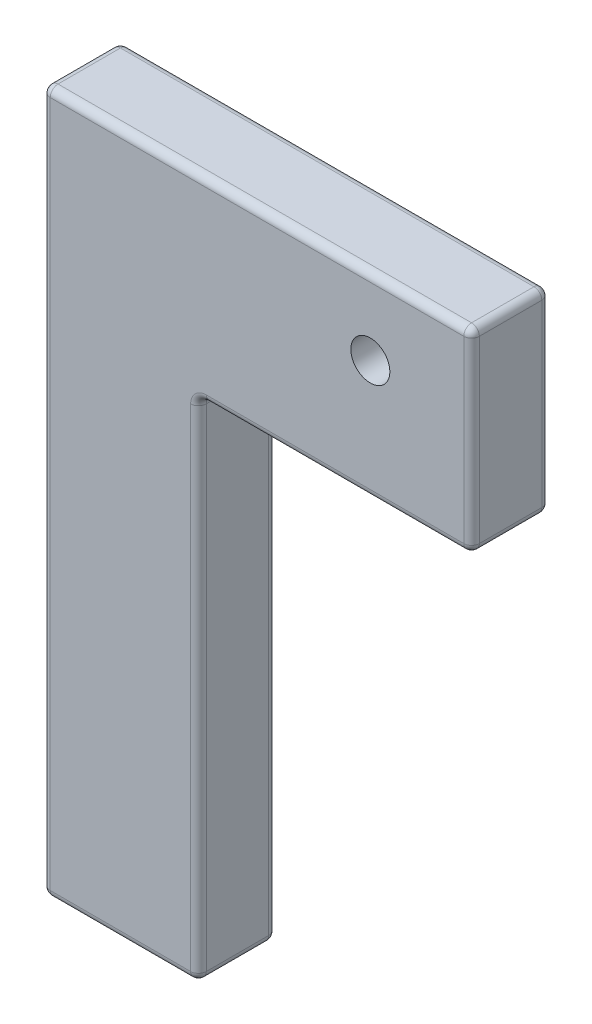
ISO-10303-21;
HEADER;
FILE_DESCRIPTION(('STEP AP214'),'2;1');
FILE_NAME('part.step','',(''),(''),'','','');
FILE_SCHEMA(('AUTOMOTIVE_DESIGN { 1 0 10303 214 1 1 1 1 }'));
ENDSEC;
DATA;
#1=APPLICATION_CONTEXT('core data for automotive mechanical design processes');
#2=APPLICATION_PROTOCOL_DEFINITION('international standard','automotive_design',2000,#1);
#3=PRODUCT_CONTEXT('',#1,'mechanical');
#4=PRODUCT('Part','Part','',(#3));
#5=PRODUCT_RELATED_PRODUCT_CATEGORY('part','',(#4));
#6=PRODUCT_DEFINITION_FORMATION('','',#4);
#7=PRODUCT_DEFINITION_CONTEXT('part definition',#1,'design');
#8=PRODUCT_DEFINITION('design','',#6,#7);
#9=PRODUCT_DEFINITION_SHAPE('','',#8);
#10=(LENGTH_UNIT() NAMED_UNIT(*) SI_UNIT(.MILLI.,.METRE.));
#11=(NAMED_UNIT(*) PLANE_ANGLE_UNIT() SI_UNIT($,.RADIAN.));
#12=(NAMED_UNIT(*) SI_UNIT($,.STERADIAN.) SOLID_ANGLE_UNIT());
#13=UNCERTAINTY_MEASURE_WITH_UNIT(LENGTH_MEASURE(1.E-05),#10,'distance_accuracy_value','');
#14=(GEOMETRIC_REPRESENTATION_CONTEXT(3) GLOBAL_UNCERTAINTY_ASSIGNED_CONTEXT((#13)) GLOBAL_UNIT_ASSIGNED_CONTEXT((#10,
#11,#12)) REPRESENTATION_CONTEXT('',''));
#15=CARTESIAN_POINT('',(0.,0.,0.));
#16=DIRECTION('',(0.,0.,1.));
#17=DIRECTION('',(1.,0.,0.));
#18=AXIS2_PLACEMENT_3D('',#15,#16,#17);
#19=CARTESIAN_POINT('',(0.,0.,10.));
#20=DIRECTION('',(0.,0.,-1.));
#21=DIRECTION('',(-1.,0.,0.));
#22=AXIS2_PLACEMENT_3D('',#19,#20,#21);
#23=PLANE('',#22);
#24=DIRECTION('',(0.,1.,0.));
#25=VECTOR('',#24,1.);
#26=CARTESIAN_POINT('',(54.,0.,10.));
#27=LINE('',#26,#25);
#28=CARTESIAN_POINT('',(54.,66.,10.));
#29=VERTEX_POINT('',#28);
#30=CARTESIAN_POINT('',(54.,89.,10.));
#31=VERTEX_POINT('',#30);
#32=EDGE_CURVE('E299',#29,#31,#27,.T.);
#33=ORIENTED_EDGE('',*,*,#32,.T.);
#34=DIRECTION('',(-1.,0.,0.));
#35=VECTOR('',#34,1.);
#36=CARTESIAN_POINT('',(0.,89.,10.));
#37=LINE('',#36,#35);
#38=CARTESIAN_POINT('',(1.,89.,10.));
#39=VERTEX_POINT('',#38);
#40=EDGE_CURVE('E302',#31,#39,#37,.T.);
#41=ORIENTED_EDGE('',*,*,#40,.T.);
#42=DIRECTION('',(0.,-1.,0.));
#43=VECTOR('',#42,1.);
#44=CARTESIAN_POINT('',(1.,0.,10.));
#45=LINE('',#44,#43);
#46=CARTESIAN_POINT('',(1.,1.,10.));
#47=VERTEX_POINT('',#46);
#48=EDGE_CURVE('E288',#39,#47,#45,.T.);
#49=ORIENTED_EDGE('',*,*,#48,.T.);
#50=DIRECTION('',(1.,0.,0.));
#51=VECTOR('',#50,1.);
#52=CARTESIAN_POINT('',(0.,1.,10.));
#53=LINE('',#52,#51);
#54=CARTESIAN_POINT('',(19.,1.,10.));
#55=VERTEX_POINT('',#54);
#56=EDGE_CURVE('E282',#47,#55,#53,.T.);
#57=ORIENTED_EDGE('',*,*,#56,.T.);
#58=DIRECTION('',(0.,1.,0.));
#59=VECTOR('',#58,1.);
#60=CARTESIAN_POINT('',(19.,0.,10.));
#61=LINE('',#60,#59);
#62=CARTESIAN_POINT('',(19.,64.,10.));
#63=VERTEX_POINT('',#62);
#64=EDGE_CURVE('E285',#55,#63,#61,.T.);
#65=ORIENTED_EDGE('',*,*,#64,.T.);
#66=CARTESIAN_POINT('',(21.,64.,10.));
#67=DIRECTION('',(0.,0.,-1.));
#68=DIRECTION('',(-1.,0.,0.));
#69=AXIS2_PLACEMENT_3D('',#66,#67,#68);
#70=CIRCLE('',#69,2.);
#71=CARTESIAN_POINT('',(21.,66.,10.));
#72=VERTEX_POINT('',#71);
#73=EDGE_CURVE('E292',#72,#63,#70,.F.);
#74=ORIENTED_EDGE('',*,*,#73,.F.);
#75=DIRECTION('',(1.,0.,0.));
#76=VECTOR('',#75,1.);
#77=CARTESIAN_POINT('',(0.,66.,10.));
#78=LINE('',#77,#76);
#79=EDGE_CURVE('E296',#72,#29,#78,.T.);
#80=ORIENTED_EDGE('',*,*,#79,.T.);
#81=EDGE_LOOP('',(#33,#41,#49,#57,#65,#74,#80));
#82=FACE_BOUND('',#81,.T.);
#83=CARTESIAN_POINT('',(42.0255877922333,80.3292942609596,10.));
#84=DIRECTION('',(0.,0.,1.));
#85=DIRECTION('',(1.,0.,0.));
#86=AXIS2_PLACEMENT_3D('',#83,#84,#85);
#87=CIRCLE('',#86,2.49999014943333);
#88=CARTESIAN_POINT('',(44.5255779416667,80.3292942609596,10.));
#89=VERTEX_POINT('',#88);
#90=EDGE_CURVE('E206',#89,#89,#87,.T.);
#91=ORIENTED_EDGE('',*,*,#90,.F.);
#92=EDGE_LOOP('',(#91));
#93=FACE_BOUND('',#92,.T.);
#94=ADVANCED_FACE('F39',(#82,#93),#23,.F.);
#95=CARTESIAN_POINT('',(0.,0.,0.));
#96=DIRECTION('',(0.,0.,-1.));
#97=DIRECTION('',(-1.,0.,0.));
#98=AXIS2_PLACEMENT_3D('',#95,#96,#97);
#99=PLANE('',#98);
#100=DIRECTION('',(1.,0.,0.));
#101=VECTOR('',#100,1.);
#102=CARTESIAN_POINT('',(0.,1.,0.));
#103=LINE('',#102,#101);
#104=CARTESIAN_POINT('',(19.,1.,0.));
#105=VERTEX_POINT('',#104);
#106=CARTESIAN_POINT('',(1.,1.,0.));
#107=VERTEX_POINT('',#106);
#108=EDGE_CURVE('E305',#105,#107,#103,.F.);
#109=ORIENTED_EDGE('',*,*,#108,.T.);
#110=DIRECTION('',(0.,-1.,0.));
#111=VECTOR('',#110,1.);
#112=CARTESIAN_POINT('',(1.,90.,0.));
#113=LINE('',#112,#111);
#114=CARTESIAN_POINT('',(1.,89.,0.));
#115=VERTEX_POINT('',#114);
#116=EDGE_CURVE('E11',#107,#115,#113,.F.);
#117=ORIENTED_EDGE('',*,*,#116,.T.);
#118=DIRECTION('',(-1.,0.,0.));
#119=VECTOR('',#118,1.);
#120=CARTESIAN_POINT('',(55.,89.,0.));
#121=LINE('',#120,#119);
#122=CARTESIAN_POINT('',(54.,89.,0.));
#123=VERTEX_POINT('',#122);
#124=EDGE_CURVE('E49',#115,#123,#121,.F.);
#125=ORIENTED_EDGE('',*,*,#124,.T.);
#126=DIRECTION('',(0.,1.,0.));
#127=VECTOR('',#126,1.);
#128=CARTESIAN_POINT('',(54.,65.,0.));
#129=LINE('',#128,#127);
#130=CARTESIAN_POINT('',(54.,66.,0.));
#131=VERTEX_POINT('',#130);
#132=EDGE_CURVE('E318',#123,#131,#129,.F.);
#133=ORIENTED_EDGE('',*,*,#132,.T.);
#134=DIRECTION('',(1.,0.,0.));
#135=VECTOR('',#134,1.);
#136=CARTESIAN_POINT('',(20.,66.,0.));
#137=LINE('',#136,#135);
#138=CARTESIAN_POINT('',(21.,66.,0.));
#139=VERTEX_POINT('',#138);
#140=EDGE_CURVE('E315',#131,#139,#137,.F.);
#141=ORIENTED_EDGE('',*,*,#140,.T.);
#142=CARTESIAN_POINT('',(21.,64.,0.));
#143=DIRECTION('',(0.,0.,-1.));
#144=DIRECTION('',(-1.,0.,0.));
#145=AXIS2_PLACEMENT_3D('',#142,#143,#144);
#146=CIRCLE('',#145,2.);
#147=CARTESIAN_POINT('',(19.,64.,0.));
#148=VERTEX_POINT('',#147);
#149=EDGE_CURVE('E311',#148,#139,#146,.T.);
#150=ORIENTED_EDGE('',*,*,#149,.F.);
#151=DIRECTION('',(0.,1.,0.));
#152=VECTOR('',#151,1.);
#153=CARTESIAN_POINT('',(19.,0.,0.));
#154=LINE('',#153,#152);
#155=EDGE_CURVE('E308',#148,#105,#154,.F.);
#156=ORIENTED_EDGE('',*,*,#155,.T.);
#157=EDGE_LOOP('',(#109,#117,#125,#133,#141,#150,#156));
#158=FACE_BOUND('',#157,.T.);
#159=CARTESIAN_POINT('',(42.0255877922333,80.3292942609596,0.));
#160=DIRECTION('',(0.,0.,1.));
#161=DIRECTION('',(1.,0.,0.));
#162=AXIS2_PLACEMENT_3D('',#159,#160,#161);
#163=CIRCLE('',#162,2.49999014943333);
#164=CARTESIAN_POINT('',(44.5255779416667,80.3292942609596,0.));
#165=VERTEX_POINT('',#164);
#166=EDGE_CURVE('E446',#165,#165,#163,.T.);
#167=ORIENTED_EDGE('',*,*,#166,.T.);
#168=EDGE_LOOP('',(#167));
#169=FACE_BOUND('',#168,.T.);
#170=ADVANCED_FACE('F465',(#158,#169),#99,.T.);
#171=CARTESIAN_POINT('',(20.,0.,10.));
#172=DIRECTION('',(0.,1.,0.));
#173=DIRECTION('',(0.,0.,1.));
#174=AXIS2_PLACEMENT_3D('',#171,#172,#173);
#175=PLANE('',#174);
#176=DIRECTION('',(0.,0.,-1.));
#177=VECTOR('',#176,1.);
#178=CARTESIAN_POINT('',(19.,0.,10.));
#179=LINE('',#178,#177);
#180=CARTESIAN_POINT('',(19.,0.,0.999999999999999));
#181=VERTEX_POINT('',#180);
#182=CARTESIAN_POINT('',(19.,0.,9.));
#183=VERTEX_POINT('',#182);
#184=EDGE_CURVE('E180',#181,#183,#179,.F.);
#185=ORIENTED_EDGE('',*,*,#184,.T.);
#186=DIRECTION('',(1.,0.,0.));
#187=VECTOR('',#186,1.);
#188=CARTESIAN_POINT('',(20.,0.,9.));
#189=LINE('',#188,#187);
#190=CARTESIAN_POINT('',(1.,0.,9.));
#191=VERTEX_POINT('',#190);
#192=EDGE_CURVE('E227',#183,#191,#189,.F.);
#193=ORIENTED_EDGE('',*,*,#192,.T.);
#194=DIRECTION('',(0.,0.,-1.));
#195=VECTOR('',#194,1.);
#196=CARTESIAN_POINT('',(1.,0.,10.));
#197=LINE('',#196,#195);
#198=CARTESIAN_POINT('',(1.,0.,0.999999999999999));
#199=VERTEX_POINT('',#198);
#200=EDGE_CURVE('E222',#191,#199,#197,.T.);
#201=ORIENTED_EDGE('',*,*,#200,.T.);
#202=DIRECTION('',(1.,0.,0.));
#203=VECTOR('',#202,1.);
#204=CARTESIAN_POINT('',(20.,0.,0.999999999999999));
#205=LINE('',#204,#203);
#206=EDGE_CURVE('E216',#199,#181,#205,.T.);
#207=ORIENTED_EDGE('',*,*,#206,.T.);
#208=EDGE_LOOP('',(#185,#193,#201,#207));
#209=FACE_BOUND('',#208,.T.);
#210=ADVANCED_FACE('F471',(#209),#175,.F.);
#211=CARTESIAN_POINT('',(20.,65.,10.));
#212=DIRECTION('',(-1.,0.,0.));
#213=DIRECTION('',(0.,-1.,0.));
#214=AXIS2_PLACEMENT_3D('',#211,#212,#213);
#215=PLANE('',#214);
#216=DIRECTION('',(0.,0.,-1.));
#217=VECTOR('',#216,1.);
#218=CARTESIAN_POINT('',(20.,64.,10.));
#219=LINE('',#218,#217);
#220=CARTESIAN_POINT('',(20.,64.,0.999999999999999));
#221=VERTEX_POINT('',#220);
#222=CARTESIAN_POINT('',(20.,64.,9.));
#223=VERTEX_POINT('',#222);
#224=EDGE_CURVE('E205',#221,#223,#219,.F.);
#225=ORIENTED_EDGE('',*,*,#224,.T.);
#226=DIRECTION('',(0.,1.,0.));
#227=VECTOR('',#226,1.);
#228=CARTESIAN_POINT('',(20.,65.,9.));
#229=LINE('',#228,#227);
#230=CARTESIAN_POINT('',(20.,1.,9.));
#231=VERTEX_POINT('',#230);
#232=EDGE_CURVE('E210',#223,#231,#229,.F.);
#233=ORIENTED_EDGE('',*,*,#232,.T.);
#234=DIRECTION('',(0.,0.,-1.));
#235=VECTOR('',#234,1.);
#236=CARTESIAN_POINT('',(20.,1.,10.));
#237=LINE('',#236,#235);
#238=CARTESIAN_POINT('',(20.,1.,0.999999999999999));
#239=VERTEX_POINT('',#238);
#240=EDGE_CURVE('E178',#231,#239,#237,.T.);
#241=ORIENTED_EDGE('',*,*,#240,.T.);
#242=DIRECTION('',(0.,1.,0.));
#243=VECTOR('',#242,1.);
#244=CARTESIAN_POINT('',(20.,65.,0.999999999999999));
#245=LINE('',#244,#243);
#246=EDGE_CURVE('E198',#239,#221,#245,.T.);
#247=ORIENTED_EDGE('',*,*,#246,.T.);
#248=EDGE_LOOP('',(#225,#233,#241,#247));
#249=FACE_BOUND('',#248,.T.);
#250=ADVANCED_FACE('F208',(#249),#215,.F.);
#251=CARTESIAN_POINT('',(55.,65.,10.));
#252=DIRECTION('',(0.,1.,0.));
#253=DIRECTION('',(0.,0.,1.));
#254=AXIS2_PLACEMENT_3D('',#251,#252,#253);
#255=PLANE('',#254);
#256=DIRECTION('',(0.,0.,-1.));
#257=VECTOR('',#256,1.);
#258=CARTESIAN_POINT('',(54.,65.,10.));
#259=LINE('',#258,#257);
#260=CARTESIAN_POINT('',(54.,65.,0.999999999999999));
#261=VERTEX_POINT('',#260);
#262=CARTESIAN_POINT('',(54.,65.,9.));
#263=VERTEX_POINT('',#262);
#264=EDGE_CURVE('E233',#261,#263,#259,.F.);
#265=ORIENTED_EDGE('',*,*,#264,.T.);
#266=DIRECTION('',(1.,0.,0.));
#267=VECTOR('',#266,1.);
#268=CARTESIAN_POINT('',(55.,65.,9.));
#269=LINE('',#268,#267);
#270=CARTESIAN_POINT('',(21.,65.,9.));
#271=VERTEX_POINT('',#270);
#272=EDGE_CURVE('E240',#263,#271,#269,.F.);
#273=ORIENTED_EDGE('',*,*,#272,.T.);
#274=DIRECTION('',(0.,0.,-1.));
#275=VECTOR('',#274,1.);
#276=CARTESIAN_POINT('',(21.,65.,0.));
#277=LINE('',#276,#275);
#278=CARTESIAN_POINT('',(21.,65.,0.999999999999999));
#279=VERTEX_POINT('',#278);
#280=EDGE_CURVE('E236',#271,#279,#277,.T.);
#281=ORIENTED_EDGE('',*,*,#280,.T.);
#282=DIRECTION('',(1.,0.,0.));
#283=VECTOR('',#282,1.);
#284=CARTESIAN_POINT('',(55.,65.,0.999999999999999));
#285=LINE('',#284,#283);
#286=EDGE_CURVE('E230',#279,#261,#285,.T.);
#287=ORIENTED_EDGE('',*,*,#286,.T.);
#288=EDGE_LOOP('',(#265,#273,#281,#287));
#289=FACE_BOUND('',#288,.T.);
#290=ADVANCED_FACE('F486',(#289),#255,.F.);
#291=CARTESIAN_POINT('',(55.,90.,10.));
#292=DIRECTION('',(-1.,0.,0.));
#293=DIRECTION('',(0.,0.,1.));
#294=AXIS2_PLACEMENT_3D('',#291,#292,#293);
#295=PLANE('',#294);
#296=DIRECTION('',(0.,0.,-1.));
#297=VECTOR('',#296,1.);
#298=CARTESIAN_POINT('',(55.,89.,10.));
#299=LINE('',#298,#297);
#300=CARTESIAN_POINT('',(55.,89.,0.999999999999999));
#301=VERTEX_POINT('',#300);
#302=CARTESIAN_POINT('',(55.,89.,9.));
#303=VERTEX_POINT('',#302);
#304=EDGE_CURVE('E246',#301,#303,#299,.F.);
#305=ORIENTED_EDGE('',*,*,#304,.T.);
#306=DIRECTION('',(0.,1.,0.));
#307=VECTOR('',#306,1.);
#308=CARTESIAN_POINT('',(55.,90.,9.));
#309=LINE('',#308,#307);
#310=CARTESIAN_POINT('',(55.,66.,9.));
#311=VERTEX_POINT('',#310);
#312=EDGE_CURVE('E253',#303,#311,#309,.F.);
#313=ORIENTED_EDGE('',*,*,#312,.T.);
#314=DIRECTION('',(0.,0.,-1.));
#315=VECTOR('',#314,1.);
#316=CARTESIAN_POINT('',(55.,66.,10.));
#317=LINE('',#316,#315);
#318=CARTESIAN_POINT('',(55.,66.,0.999999999999999));
#319=VERTEX_POINT('',#318);
#320=EDGE_CURVE('E249',#311,#319,#317,.T.);
#321=ORIENTED_EDGE('',*,*,#320,.T.);
#322=DIRECTION('',(0.,1.,0.));
#323=VECTOR('',#322,1.);
#324=CARTESIAN_POINT('',(55.,90.,0.999999999999999));
#325=LINE('',#324,#323);
#326=EDGE_CURVE('E243',#319,#301,#325,.T.);
#327=ORIENTED_EDGE('',*,*,#326,.T.);
#328=EDGE_LOOP('',(#305,#313,#321,#327));
#329=FACE_BOUND('',#328,.T.);
#330=ADVANCED_FACE('F482',(#329),#295,.F.);
#331=CARTESIAN_POINT('',(0.,90.,10.));
#332=DIRECTION('',(0.,-1.,0.));
#333=DIRECTION('',(0.,0.,-1.));
#334=AXIS2_PLACEMENT_3D('',#331,#332,#333);
#335=PLANE('',#334);
#336=DIRECTION('',(0.,0.,-1.));
#337=VECTOR('',#336,1.);
#338=CARTESIAN_POINT('',(1.,90.,10.));
#339=LINE('',#338,#337);
#340=CARTESIAN_POINT('',(1.,90.,0.999999999999999));
#341=VERTEX_POINT('',#340);
#342=CARTESIAN_POINT('',(1.,90.,9.));
#343=VERTEX_POINT('',#342);
#344=EDGE_CURVE('E259',#341,#343,#339,.F.);
#345=ORIENTED_EDGE('',*,*,#344,.T.);
#346=DIRECTION('',(-1.,0.,0.));
#347=VECTOR('',#346,1.);
#348=CARTESIAN_POINT('',(0.,90.,9.));
#349=LINE('',#348,#347);
#350=CARTESIAN_POINT('',(54.,90.,9.));
#351=VERTEX_POINT('',#350);
#352=EDGE_CURVE('E266',#343,#351,#349,.F.);
#353=ORIENTED_EDGE('',*,*,#352,.T.);
#354=DIRECTION('',(0.,0.,-1.));
#355=VECTOR('',#354,1.);
#356=CARTESIAN_POINT('',(54.,90.,10.));
#357=LINE('',#356,#355);
#358=CARTESIAN_POINT('',(54.,90.,0.999999999999999));
#359=VERTEX_POINT('',#358);
#360=EDGE_CURVE('E262',#351,#359,#357,.T.);
#361=ORIENTED_EDGE('',*,*,#360,.T.);
#362=DIRECTION('',(-1.,0.,0.));
#363=VECTOR('',#362,1.);
#364=CARTESIAN_POINT('',(0.,90.,0.999999999999999));
#365=LINE('',#364,#363);
#366=EDGE_CURVE('E256',#359,#341,#365,.T.);
#367=ORIENTED_EDGE('',*,*,#366,.T.);
#368=EDGE_LOOP('',(#345,#353,#361,#367));
#369=FACE_BOUND('',#368,.T.);
#370=ADVANCED_FACE('F478',(#369),#335,.F.);
#371=CARTESIAN_POINT('',(0.,0.,10.));
#372=DIRECTION('',(1.,0.,0.));
#373=DIRECTION('',(0.,0.,-1.));
#374=AXIS2_PLACEMENT_3D('',#371,#372,#373);
#375=PLANE('',#374);
#376=DIRECTION('',(0.,0.,-1.));
#377=VECTOR('',#376,1.);
#378=CARTESIAN_POINT('',(0.,1.,10.));
#379=LINE('',#378,#377);
#380=CARTESIAN_POINT('',(0.,1.,0.999999999999999));
#381=VERTEX_POINT('',#380);
#382=CARTESIAN_POINT('',(0.,1.,9.));
#383=VERTEX_POINT('',#382);
#384=EDGE_CURVE('E272',#381,#383,#379,.F.);
#385=ORIENTED_EDGE('',*,*,#384,.T.);
#386=DIRECTION('',(0.,-1.,0.));
#387=VECTOR('',#386,1.);
#388=CARTESIAN_POINT('',(0.,0.,9.));
#389=LINE('',#388,#387);
#390=CARTESIAN_POINT('',(0.,89.,9.));
#391=VERTEX_POINT('',#390);
#392=EDGE_CURVE('E279',#383,#391,#389,.F.);
#393=ORIENTED_EDGE('',*,*,#392,.T.);
#394=DIRECTION('',(0.,0.,-1.));
#395=VECTOR('',#394,1.);
#396=CARTESIAN_POINT('',(0.,89.,10.));
#397=LINE('',#396,#395);
#398=CARTESIAN_POINT('',(0.,89.,0.999999999999999));
#399=VERTEX_POINT('',#398);
#400=EDGE_CURVE('E275',#391,#399,#397,.T.);
#401=ORIENTED_EDGE('',*,*,#400,.T.);
#402=DIRECTION('',(0.,-1.,0.));
#403=VECTOR('',#402,1.);
#404=CARTESIAN_POINT('',(0.,0.,0.999999999999999));
#405=LINE('',#404,#403);
#406=EDGE_CURVE('E269',#399,#381,#405,.T.);
#407=ORIENTED_EDGE('',*,*,#406,.T.);
#408=EDGE_LOOP('',(#385,#393,#401,#407));
#409=FACE_BOUND('',#408,.T.);
#410=ADVANCED_FACE('F475',(#409),#375,.F.);
#411=CARTESIAN_POINT('',(42.0255877922333,80.3292942609596,10.));
#412=DIRECTION('',(0.,0.,-1.));
#413=DIRECTION('',(-1.,0.,0.));
#414=AXIS2_PLACEMENT_3D('',#411,#412,#413);
#415=CYLINDRICAL_SURFACE('',#414,2.49999014943333);
#416=ORIENTED_EDGE('',*,*,#90,.T.);
#417=EDGE_LOOP('',(#416));
#418=FACE_BOUND('',#417,.T.);
#419=ORIENTED_EDGE('',*,*,#166,.F.);
#420=EDGE_LOOP('',(#419));
#421=FACE_BOUND('',#420,.T.);
#422=ADVANCED_FACE('F461',(#418,#421),#415,.F.);
#423=CARTESIAN_POINT('',(54.,89.,10.));
#424=DIRECTION('',(0.,0.,-1.));
#425=DIRECTION('',(-1.,0.,0.));
#426=AXIS2_PLACEMENT_3D('',#423,#424,#425);
#427=CYLINDRICAL_SURFACE('',#426,1.);
#428=CARTESIAN_POINT('',(54.,89.,9.));
#429=DIRECTION('',(0.,0.,1.));
#430=DIRECTION('',(1.,0.,0.));
#431=AXIS2_PLACEMENT_3D('',#428,#429,#430);
#432=CIRCLE('',#431,1.);
#433=EDGE_CURVE('E43',#303,#351,#432,.T.);
#434=ORIENTED_EDGE('',*,*,#433,.F.);
#435=ORIENTED_EDGE('',*,*,#304,.F.);
#436=CARTESIAN_POINT('',(54.,89.,0.999999999999999));
#437=DIRECTION('',(0.,0.,-1.));
#438=DIRECTION('',(-1.,0.,0.));
#439=AXIS2_PLACEMENT_3D('',#436,#437,#438);
#440=CIRCLE('',#439,1.);
#441=EDGE_CURVE('E437',#359,#301,#440,.T.);
#442=ORIENTED_EDGE('',*,*,#441,.F.);
#443=ORIENTED_EDGE('',*,*,#360,.F.);
#444=EDGE_LOOP('',(#434,#435,#442,#443));
#445=FACE_BOUND('',#444,.T.);
#446=ADVANCED_FACE('F41',(#445),#427,.T.);
#447=CARTESIAN_POINT('',(54.,89.,9.));
#448=DIRECTION('',(0.,0.,1.));
#449=DIRECTION('',(1.,0.,0.));
#450=AXIS2_PLACEMENT_3D('',#447,#448,#449);
#451=SPHERICAL_SURFACE('',#450,1.);
#452=CARTESIAN_POINT('',(54.,89.,9.));
#453=DIRECTION('',(0.,1.,0.));
#454=DIRECTION('',(0.,0.,1.));
#455=AXIS2_PLACEMENT_3D('',#452,#453,#454);
#456=CIRCLE('',#455,1.);
#457=EDGE_CURVE('E430',#303,#31,#456,.F.);
#458=ORIENTED_EDGE('',*,*,#457,.F.);
#459=ORIENTED_EDGE('',*,*,#433,.T.);
#460=CARTESIAN_POINT('',(54.,89.,9.));
#461=DIRECTION('',(1.,0.,0.));
#462=DIRECTION('',(0.,0.,-1.));
#463=AXIS2_PLACEMENT_3D('',#460,#461,#462);
#464=CIRCLE('',#463,1.);
#465=EDGE_CURVE('E434',#31,#351,#464,.F.);
#466=ORIENTED_EDGE('',*,*,#465,.F.);
#467=EDGE_LOOP('',(#458,#459,#466));
#468=FACE_BOUND('',#467,.T.);
#469=ADVANCED_FACE('F599',(#468),#451,.T.);
#470=CARTESIAN_POINT('',(54.,89.,1.));
#471=DIRECTION('',(0.,0.,1.));
#472=DIRECTION('',(1.,0.,0.));
#473=AXIS2_PLACEMENT_3D('',#470,#471,#472);
#474=SPHERICAL_SURFACE('',#473,1.);
#475=CARTESIAN_POINT('',(54.,89.,1.));
#476=DIRECTION('',(1.,0.,0.));
#477=DIRECTION('',(0.,0.,-1.));
#478=AXIS2_PLACEMENT_3D('',#475,#476,#477);
#479=CIRCLE('',#478,1.);
#480=EDGE_CURVE('E423',#359,#123,#479,.F.);
#481=ORIENTED_EDGE('',*,*,#480,.F.);
#482=ORIENTED_EDGE('',*,*,#441,.T.);
#483=CARTESIAN_POINT('',(54.,89.,0.999999999999999));
#484=DIRECTION('',(0.,1.,0.));
#485=DIRECTION('',(0.,0.,1.));
#486=AXIS2_PLACEMENT_3D('',#483,#484,#485);
#487=CIRCLE('',#486,1.);
#488=EDGE_CURVE('E426',#123,#301,#487,.F.);
#489=ORIENTED_EDGE('',*,*,#488,.F.);
#490=EDGE_LOOP('',(#481,#482,#489));
#491=FACE_BOUND('',#490,.T.);
#492=ADVANCED_FACE('F596',(#491),#474,.T.);
#493=CARTESIAN_POINT('',(0.,89.,9.));
#494=DIRECTION('',(-1.,0.,0.));
#495=DIRECTION('',(0.,0.,1.));
#496=AXIS2_PLACEMENT_3D('',#493,#494,#495);
#497=CYLINDRICAL_SURFACE('',#496,1.);
#498=ORIENTED_EDGE('',*,*,#465,.T.);
#499=ORIENTED_EDGE('',*,*,#352,.F.);
#500=CARTESIAN_POINT('',(1.,89.,9.));
#501=DIRECTION('',(-1.,0.,0.));
#502=DIRECTION('',(0.,0.,1.));
#503=AXIS2_PLACEMENT_3D('',#500,#501,#502);
#504=CIRCLE('',#503,1.);
#505=EDGE_CURVE('E415',#39,#343,#504,.T.);
#506=ORIENTED_EDGE('',*,*,#505,.F.);
#507=ORIENTED_EDGE('',*,*,#40,.F.);
#508=EDGE_LOOP('',(#498,#499,#506,#507));
#509=FACE_BOUND('',#508,.T.);
#510=ADVANCED_FACE('F592',(#509),#497,.T.);
#511=CARTESIAN_POINT('',(54.,0.,9.));
#512=DIRECTION('',(0.,1.,0.));
#513=DIRECTION('',(0.,0.,1.));
#514=AXIS2_PLACEMENT_3D('',#511,#512,#513);
#515=CYLINDRICAL_SURFACE('',#514,1.);
#516=ORIENTED_EDGE('',*,*,#457,.T.);
#517=ORIENTED_EDGE('',*,*,#32,.F.);
#518=CARTESIAN_POINT('',(54.,66.,9.));
#519=DIRECTION('',(0.,-1.,0.));
#520=DIRECTION('',(0.,0.,-1.));
#521=AXIS2_PLACEMENT_3D('',#518,#519,#520);
#522=CIRCLE('',#521,1.);
#523=EDGE_CURVE('E411',#311,#29,#522,.T.);
#524=ORIENTED_EDGE('',*,*,#523,.F.);
#525=ORIENTED_EDGE('',*,*,#312,.F.);
#526=EDGE_LOOP('',(#516,#517,#524,#525));
#527=FACE_BOUND('',#526,.T.);
#528=ADVANCED_FACE('F588',(#527),#515,.T.);
#529=CARTESIAN_POINT('',(54.,66.,10.));
#530=DIRECTION('',(0.,0.,-1.));
#531=DIRECTION('',(-1.,0.,0.));
#532=AXIS2_PLACEMENT_3D('',#529,#530,#531);
#533=CYLINDRICAL_SURFACE('',#532,1.);
#534=CARTESIAN_POINT('',(54.,66.,0.999999999999999));
#535=DIRECTION('',(0.,0.,-1.));
#536=DIRECTION('',(-1.,0.,0.));
#537=AXIS2_PLACEMENT_3D('',#534,#535,#536);
#538=CIRCLE('',#537,1.);
#539=EDGE_CURVE('E403',#319,#261,#538,.T.);
#540=ORIENTED_EDGE('',*,*,#539,.F.);
#541=ORIENTED_EDGE('',*,*,#320,.F.);
#542=CARTESIAN_POINT('',(54.,66.,9.));
#543=DIRECTION('',(0.,0.,1.));
#544=DIRECTION('',(1.,0.,0.));
#545=AXIS2_PLACEMENT_3D('',#542,#543,#544);
#546=CIRCLE('',#545,1.);
#547=EDGE_CURVE('E407',#263,#311,#546,.T.);
#548=ORIENTED_EDGE('',*,*,#547,.F.);
#549=ORIENTED_EDGE('',*,*,#264,.F.);
#550=EDGE_LOOP('',(#540,#541,#548,#549));
#551=FACE_BOUND('',#550,.T.);
#552=ADVANCED_FACE('F584',(#551),#533,.T.);
#553=CARTESIAN_POINT('',(54.,90.,0.999999999999999));
#554=DIRECTION('',(0.,-1.,0.));
#555=DIRECTION('',(0.,0.,-1.));
#556=AXIS2_PLACEMENT_3D('',#553,#554,#555);
#557=CYLINDRICAL_SURFACE('',#556,1.);
#558=ORIENTED_EDGE('',*,*,#488,.T.);
#559=ORIENTED_EDGE('',*,*,#326,.F.);
#560=CARTESIAN_POINT('',(54.,66.,1.));
#561=DIRECTION('',(0.,-1.,0.));
#562=DIRECTION('',(0.,0.,-1.));
#563=AXIS2_PLACEMENT_3D('',#560,#561,#562);
#564=CIRCLE('',#563,1.);
#565=EDGE_CURVE('E400',#131,#319,#564,.T.);
#566=ORIENTED_EDGE('',*,*,#565,.F.);
#567=ORIENTED_EDGE('',*,*,#132,.F.);
#568=EDGE_LOOP('',(#558,#559,#566,#567));
#569=FACE_BOUND('',#568,.T.);
#570=ADVANCED_FACE('F580',(#569),#557,.T.);
#571=CARTESIAN_POINT('',(0.,89.,0.999999999999999));
#572=DIRECTION('',(1.,0.,0.));
#573=DIRECTION('',(0.,0.,-1.));
#574=AXIS2_PLACEMENT_3D('',#571,#572,#573);
#575=CYLINDRICAL_SURFACE('',#574,1.);
#576=ORIENTED_EDGE('',*,*,#480,.T.);
#577=ORIENTED_EDGE('',*,*,#124,.F.);
#578=CARTESIAN_POINT('',(1.,89.,0.999999999999999));
#579=DIRECTION('',(-1.,0.,0.));
#580=DIRECTION('',(0.,0.,1.));
#581=AXIS2_PLACEMENT_3D('',#578,#579,#580);
#582=CIRCLE('',#581,1.);
#583=EDGE_CURVE('E397',#341,#115,#582,.T.);
#584=ORIENTED_EDGE('',*,*,#583,.F.);
#585=ORIENTED_EDGE('',*,*,#366,.F.);
#586=EDGE_LOOP('',(#576,#577,#584,#585));
#587=FACE_BOUND('',#586,.T.);
#588=ADVANCED_FACE('F576',(#587),#575,.T.);
#589=CARTESIAN_POINT('',(1.,89.,10.));
#590=DIRECTION('',(0.,0.,-1.));
#591=DIRECTION('',(-1.,0.,0.));
#592=AXIS2_PLACEMENT_3D('',#589,#590,#591);
#593=CYLINDRICAL_SURFACE('',#592,1.);
#594=CARTESIAN_POINT('',(1.,89.,9.));
#595=DIRECTION('',(0.,0.,1.));
#596=DIRECTION('',(1.,0.,0.));
#597=AXIS2_PLACEMENT_3D('',#594,#595,#596);
#598=CIRCLE('',#597,1.);
#599=EDGE_CURVE('E419',#343,#391,#598,.T.);
#600=ORIENTED_EDGE('',*,*,#599,.F.);
#601=ORIENTED_EDGE('',*,*,#344,.F.);
#602=CARTESIAN_POINT('',(1.,89.,0.999999999999999));
#603=DIRECTION('',(0.,0.,-1.));
#604=DIRECTION('',(-1.,0.,0.));
#605=AXIS2_PLACEMENT_3D('',#602,#603,#604);
#606=CIRCLE('',#605,1.);
#607=EDGE_CURVE('E393',#399,#341,#606,.T.);
#608=ORIENTED_EDGE('',*,*,#607,.F.);
#609=ORIENTED_EDGE('',*,*,#400,.F.);
#610=EDGE_LOOP('',(#600,#601,#608,#609));
#611=FACE_BOUND('',#610,.T.);
#612=ADVANCED_FACE('F572',(#611),#593,.T.);
#613=CARTESIAN_POINT('',(1.,89.,9.));
#614=DIRECTION('',(0.,0.,1.));
#615=DIRECTION('',(1.,0.,0.));
#616=AXIS2_PLACEMENT_3D('',#613,#614,#615);
#617=SPHERICAL_SURFACE('',#616,1.);
#618=ORIENTED_EDGE('',*,*,#505,.T.);
#619=ORIENTED_EDGE('',*,*,#599,.T.);
#620=CARTESIAN_POINT('',(1.,89.,9.));
#621=DIRECTION('',(0.,1.,0.));
#622=DIRECTION('',(0.,0.,1.));
#623=AXIS2_PLACEMENT_3D('',#620,#621,#622);
#624=CIRCLE('',#623,1.);
#625=EDGE_CURVE('E389',#39,#391,#624,.F.);
#626=ORIENTED_EDGE('',*,*,#625,.F.);
#627=EDGE_LOOP('',(#618,#619,#626));
#628=FACE_BOUND('',#627,.T.);
#629=ADVANCED_FACE('F568',(#628),#617,.T.);
#630=CARTESIAN_POINT('',(54.,66.,9.));
#631=DIRECTION('',(0.,0.,1.));
#632=DIRECTION('',(1.,0.,0.));
#633=AXIS2_PLACEMENT_3D('',#630,#631,#632);
#634=SPHERICAL_SURFACE('',#633,1.);
#635=ORIENTED_EDGE('',*,*,#547,.T.);
#636=ORIENTED_EDGE('',*,*,#523,.T.);
#637=CARTESIAN_POINT('',(54.,66.,9.));
#638=DIRECTION('',(1.,0.,0.));
#639=DIRECTION('',(0.,0.,-1.));
#640=AXIS2_PLACEMENT_3D('',#637,#638,#639);
#641=CIRCLE('',#640,1.);
#642=EDGE_CURVE('E385',#263,#29,#641,.F.);
#643=ORIENTED_EDGE('',*,*,#642,.F.);
#644=EDGE_LOOP('',(#635,#636,#643));
#645=FACE_BOUND('',#644,.T.);
#646=ADVANCED_FACE('F564',(#645),#634,.T.);
#647=CARTESIAN_POINT('',(54.,66.,1.));
#648=DIRECTION('',(0.,0.,1.));
#649=DIRECTION('',(1.,0.,0.));
#650=AXIS2_PLACEMENT_3D('',#647,#648,#649);
#651=SPHERICAL_SURFACE('',#650,1.);
#652=ORIENTED_EDGE('',*,*,#565,.T.);
#653=ORIENTED_EDGE('',*,*,#539,.T.);
#654=CARTESIAN_POINT('',(54.,66.,0.999999999999999));
#655=DIRECTION('',(1.,0.,0.));
#656=DIRECTION('',(0.,0.,-1.));
#657=AXIS2_PLACEMENT_3D('',#654,#655,#656);
#658=CIRCLE('',#657,1.);
#659=EDGE_CURVE('E381',#131,#261,#658,.F.);
#660=ORIENTED_EDGE('',*,*,#659,.F.);
#661=EDGE_LOOP('',(#652,#653,#660));
#662=FACE_BOUND('',#661,.T.);
#663=ADVANCED_FACE('F560',(#662),#651,.T.);
#664=CARTESIAN_POINT('',(1.,89.,1.));
#665=DIRECTION('',(0.,0.,1.));
#666=DIRECTION('',(1.,0.,0.));
#667=AXIS2_PLACEMENT_3D('',#664,#665,#666);
#668=SPHERICAL_SURFACE('',#667,1.);
#669=ORIENTED_EDGE('',*,*,#607,.T.);
#670=ORIENTED_EDGE('',*,*,#583,.T.);
#671=CARTESIAN_POINT('',(1.,89.,1.));
#672=DIRECTION('',(0.,1.,0.));
#673=DIRECTION('',(0.,0.,1.));
#674=AXIS2_PLACEMENT_3D('',#671,#672,#673);
#675=CIRCLE('',#674,1.);
#676=EDGE_CURVE('E57',#399,#115,#675,.F.);
#677=ORIENTED_EDGE('',*,*,#676,.F.);
#678=EDGE_LOOP('',(#669,#670,#677));
#679=FACE_BOUND('',#678,.T.);
#680=ADVANCED_FACE('F556',(#679),#668,.T.);
#681=CARTESIAN_POINT('',(1.,0.,9.));
#682=DIRECTION('',(0.,-1.,0.));
#683=DIRECTION('',(0.,0.,-1.));
#684=AXIS2_PLACEMENT_3D('',#681,#682,#683);
#685=CYLINDRICAL_SURFACE('',#684,1.);
#686=ORIENTED_EDGE('',*,*,#625,.T.);
#687=ORIENTED_EDGE('',*,*,#392,.F.);
#688=CARTESIAN_POINT('',(1.,1.,9.));
#689=DIRECTION('',(0.,-1.,0.));
#690=DIRECTION('',(0.,0.,-1.));
#691=AXIS2_PLACEMENT_3D('',#688,#689,#690);
#692=CIRCLE('',#691,1.);
#693=EDGE_CURVE('E371',#47,#383,#692,.T.);
#694=ORIENTED_EDGE('',*,*,#693,.F.);
#695=ORIENTED_EDGE('',*,*,#48,.F.);
#696=EDGE_LOOP('',(#686,#687,#694,#695));
#697=FACE_BOUND('',#696,.T.);
#698=ADVANCED_FACE('F552',(#697),#685,.T.);
#699=CARTESIAN_POINT('',(0.,66.,9.));
#700=DIRECTION('',(1.,0.,0.));
#701=DIRECTION('',(0.,0.,-1.));
#702=AXIS2_PLACEMENT_3D('',#699,#700,#701);
#703=CYLINDRICAL_SURFACE('',#702,1.);
#704=ORIENTED_EDGE('',*,*,#642,.T.);
#705=ORIENTED_EDGE('',*,*,#79,.F.);
#706=CARTESIAN_POINT('',(21.,66.,9.));
#707=DIRECTION('',(-1.,0.,0.));
#708=DIRECTION('',(0.,0.,1.));
#709=AXIS2_PLACEMENT_3D('',#706,#707,#708);
#710=CIRCLE('',#709,1.);
#711=EDGE_CURVE('E367',#271,#72,#710,.T.);
#712=ORIENTED_EDGE('',*,*,#711,.F.);
#713=ORIENTED_EDGE('',*,*,#272,.F.);
#714=EDGE_LOOP('',(#704,#705,#712,#713));
#715=FACE_BOUND('',#714,.T.);
#716=ADVANCED_FACE('F548',(#715),#703,.T.);
#717=CARTESIAN_POINT('',(21.,64.,10.));
#718=DIRECTION('',(0.,0.,1.));
#719=DIRECTION('',(1.,0.,0.));
#720=AXIS2_PLACEMENT_3D('',#717,#718,#719);
#721=CYLINDRICAL_SURFACE('',#720,1.);
#722=CARTESIAN_POINT('',(21.,64.,0.999999999999999));
#723=DIRECTION('',(0.,0.,-1.));
#724=DIRECTION('',(-1.,0.,0.));
#725=AXIS2_PLACEMENT_3D('',#722,#723,#724);
#726=CIRCLE('',#725,1.);
#727=EDGE_CURVE('E359',#279,#221,#726,.F.);
#728=ORIENTED_EDGE('',*,*,#727,.F.);
#729=ORIENTED_EDGE('',*,*,#280,.F.);
#730=CARTESIAN_POINT('',(21.,64.,9.));
#731=DIRECTION('',(0.,0.,-1.));
#732=DIRECTION('',(-1.,0.,0.));
#733=AXIS2_PLACEMENT_3D('',#730,#731,#732);
#734=CIRCLE('',#733,1.);
#735=EDGE_CURVE('E363',#223,#271,#734,.T.);
#736=ORIENTED_EDGE('',*,*,#735,.F.);
#737=ORIENTED_EDGE('',*,*,#224,.F.);
#738=EDGE_LOOP('',(#728,#729,#736,#737));
#739=FACE_BOUND('',#738,.T.);
#740=ADVANCED_FACE('F544',(#739),#721,.F.);
#741=CARTESIAN_POINT('',(55.,66.,0.999999999999999));
#742=DIRECTION('',(-1.,0.,0.));
#743=DIRECTION('',(0.,0.,1.));
#744=AXIS2_PLACEMENT_3D('',#741,#742,#743);
#745=CYLINDRICAL_SURFACE('',#744,1.);
#746=ORIENTED_EDGE('',*,*,#659,.T.);
#747=ORIENTED_EDGE('',*,*,#286,.F.);
#748=CARTESIAN_POINT('',(21.,66.,1.));
#749=DIRECTION('',(-1.,0.,0.));
#750=DIRECTION('',(0.,0.,1.));
#751=AXIS2_PLACEMENT_3D('',#748,#749,#750);
#752=CIRCLE('',#751,1.);
#753=EDGE_CURVE('E356',#139,#279,#752,.T.);
#754=ORIENTED_EDGE('',*,*,#753,.F.);
#755=ORIENTED_EDGE('',*,*,#140,.F.);
#756=EDGE_LOOP('',(#746,#747,#754,#755));
#757=FACE_BOUND('',#756,.T.);
#758=ADVANCED_FACE('F541',(#757),#745,.T.);
#759=CARTESIAN_POINT('',(1.,0.,0.999999999999999));
#760=DIRECTION('',(0.,1.,0.));
#761=DIRECTION('',(0.,0.,1.));
#762=AXIS2_PLACEMENT_3D('',#759,#760,#761);
#763=CYLINDRICAL_SURFACE('',#762,1.);
#764=ORIENTED_EDGE('',*,*,#676,.T.);
#765=ORIENTED_EDGE('',*,*,#116,.F.);
#766=CARTESIAN_POINT('',(1.,1.,0.999999999999999));
#767=DIRECTION('',(0.,-1.,0.));
#768=DIRECTION('',(0.,0.,-1.));
#769=AXIS2_PLACEMENT_3D('',#766,#767,#768);
#770=CIRCLE('',#769,1.);
#771=EDGE_CURVE('E352',#381,#107,#770,.T.);
#772=ORIENTED_EDGE('',*,*,#771,.F.);
#773=ORIENTED_EDGE('',*,*,#406,.F.);
#774=EDGE_LOOP('',(#764,#765,#772,#773));
#775=FACE_BOUND('',#774,.T.);
#776=ADVANCED_FACE('F537',(#775),#763,.T.);
#777=CARTESIAN_POINT('',(1.,1.,10.));
#778=DIRECTION('',(0.,0.,-1.));
#779=DIRECTION('',(-1.,0.,0.));
#780=AXIS2_PLACEMENT_3D('',#777,#778,#779);
#781=CYLINDRICAL_SURFACE('',#780,1.);
#782=CARTESIAN_POINT('',(1.,1.,9.));
#783=DIRECTION('',(0.,0.,1.));
#784=DIRECTION('',(1.,0.,0.));
#785=AXIS2_PLACEMENT_3D('',#782,#783,#784);
#786=CIRCLE('',#785,1.);
#787=EDGE_CURVE('E375',#383,#191,#786,.T.);
#788=ORIENTED_EDGE('',*,*,#787,.F.);
#789=ORIENTED_EDGE('',*,*,#384,.F.);
#790=CARTESIAN_POINT('',(1.,1.,0.999999999999999));
#791=DIRECTION('',(0.,0.,-1.));
#792=DIRECTION('',(-1.,0.,0.));
#793=AXIS2_PLACEMENT_3D('',#790,#791,#792);
#794=CIRCLE('',#793,1.);
#795=EDGE_CURVE('E348',#199,#381,#794,.T.);
#796=ORIENTED_EDGE('',*,*,#795,.F.);
#797=ORIENTED_EDGE('',*,*,#200,.F.);
#798=EDGE_LOOP('',(#788,#789,#796,#797));
#799=FACE_BOUND('',#798,.T.);
#800=ADVANCED_FACE('F533',(#799),#781,.T.);
#801=CARTESIAN_POINT('',(1.,1.,9.));
#802=DIRECTION('',(0.,0.,1.));
#803=DIRECTION('',(1.,0.,0.));
#804=AXIS2_PLACEMENT_3D('',#801,#802,#803);
#805=SPHERICAL_SURFACE('',#804,1.);
#806=ORIENTED_EDGE('',*,*,#693,.T.);
#807=ORIENTED_EDGE('',*,*,#787,.T.);
#808=CARTESIAN_POINT('',(1.,1.,9.));
#809=DIRECTION('',(-1.,0.,0.));
#810=DIRECTION('',(0.,0.,1.));
#811=AXIS2_PLACEMENT_3D('',#808,#809,#810);
#812=CIRCLE('',#811,1.);
#813=EDGE_CURVE('E344',#47,#191,#812,.F.);
#814=ORIENTED_EDGE('',*,*,#813,.F.);
#815=EDGE_LOOP('',(#806,#807,#814));
#816=FACE_BOUND('',#815,.T.);
#817=ADVANCED_FACE('F529',(#816),#805,.T.);
#818=CARTESIAN_POINT('',(21.,64.,9.));
#819=DIRECTION('',(0.,0.,-1.));
#820=DIRECTION('',(-1.,0.,0.));
#821=AXIS2_PLACEMENT_3D('',#818,#819,#820);
#822=TOROIDAL_SURFACE('',#821,2.,1.);
#823=ORIENTED_EDGE('',*,*,#711,.T.);
#824=ORIENTED_EDGE('',*,*,#73,.T.);
#825=CARTESIAN_POINT('',(19.,64.,9.));
#826=DIRECTION('',(0.,1.,0.));
#827=DIRECTION('',(0.,0.,1.));
#828=AXIS2_PLACEMENT_3D('',#825,#826,#827);
#829=CIRCLE('',#828,1.);
#830=EDGE_CURVE('E340',#223,#63,#829,.F.);
#831=ORIENTED_EDGE('',*,*,#830,.F.);
#832=ORIENTED_EDGE('',*,*,#735,.T.);
#833=EDGE_LOOP('',(#823,#824,#831,#832));
#834=FACE_BOUND('',#833,.T.);
#835=ADVANCED_FACE('F525',(#834),#822,.T.);
#836=CARTESIAN_POINT('',(21.,64.,0.999999999999999));
#837=DIRECTION('',(0.,0.,-1.));
#838=DIRECTION('',(-1.,0.,0.));
#839=AXIS2_PLACEMENT_3D('',#836,#837,#838);
#840=TOROIDAL_SURFACE('',#839,2.,1.);
#841=ORIENTED_EDGE('',*,*,#753,.T.);
#842=ORIENTED_EDGE('',*,*,#727,.T.);
#843=CARTESIAN_POINT('',(19.,64.,0.999999999999999));
#844=DIRECTION('',(0.,1.,0.));
#845=DIRECTION('',(0.,0.,1.));
#846=AXIS2_PLACEMENT_3D('',#843,#844,#845);
#847=CIRCLE('',#846,1.);
#848=EDGE_CURVE('E201',#148,#221,#847,.F.);
#849=ORIENTED_EDGE('',*,*,#848,.F.);
#850=ORIENTED_EDGE('',*,*,#149,.T.);
#851=EDGE_LOOP('',(#841,#842,#849,#850));
#852=FACE_BOUND('',#851,.T.);
#853=ADVANCED_FACE('F521',(#852),#840,.T.);
#854=CARTESIAN_POINT('',(1.,1.,1.));
#855=DIRECTION('',(0.,0.,1.));
#856=DIRECTION('',(1.,0.,0.));
#857=AXIS2_PLACEMENT_3D('',#854,#855,#856);
#858=SPHERICAL_SURFACE('',#857,1.);
#859=ORIENTED_EDGE('',*,*,#795,.T.);
#860=ORIENTED_EDGE('',*,*,#771,.T.);
#861=CARTESIAN_POINT('',(1.,1.,1.));
#862=DIRECTION('',(-1.,0.,0.));
#863=DIRECTION('',(0.,-1.,0.));
#864=AXIS2_PLACEMENT_3D('',#861,#862,#863);
#865=CIRCLE('',#864,1.);
#866=EDGE_CURVE('E334',#199,#107,#865,.F.);
#867=ORIENTED_EDGE('',*,*,#866,.F.);
#868=EDGE_LOOP('',(#859,#860,#867));
#869=FACE_BOUND('',#868,.T.);
#870=ADVANCED_FACE('F517',(#869),#858,.T.);
#871=CARTESIAN_POINT('',(0.,1.,9.));
#872=DIRECTION('',(1.,0.,0.));
#873=DIRECTION('',(0.,0.,-1.));
#874=AXIS2_PLACEMENT_3D('',#871,#872,#873);
#875=CYLINDRICAL_SURFACE('',#874,1.);
#876=ORIENTED_EDGE('',*,*,#813,.T.);
#877=ORIENTED_EDGE('',*,*,#192,.F.);
#878=CARTESIAN_POINT('',(19.,1.,9.));
#879=DIRECTION('',(1.,0.,0.));
#880=DIRECTION('',(0.,0.,-1.));
#881=AXIS2_PLACEMENT_3D('',#878,#879,#880);
#882=CIRCLE('',#881,1.);
#883=EDGE_CURVE('E330',#55,#183,#882,.T.);
#884=ORIENTED_EDGE('',*,*,#883,.F.);
#885=ORIENTED_EDGE('',*,*,#56,.F.);
#886=EDGE_LOOP('',(#876,#877,#884,#885));
#887=FACE_BOUND('',#886,.T.);
#888=ADVANCED_FACE('F513',(#887),#875,.T.);
#889=CARTESIAN_POINT('',(19.,0.,9.));
#890=DIRECTION('',(0.,1.,0.));
#891=DIRECTION('',(-1.,0.,0.));
#892=AXIS2_PLACEMENT_3D('',#889,#890,#891);
#893=CYLINDRICAL_SURFACE('',#892,1.);
#894=ORIENTED_EDGE('',*,*,#830,.T.);
#895=ORIENTED_EDGE('',*,*,#64,.F.);
#896=CARTESIAN_POINT('',(19.,1.,9.));
#897=DIRECTION('',(0.,-1.,0.));
#898=DIRECTION('',(0.,0.,-1.));
#899=AXIS2_PLACEMENT_3D('',#896,#897,#898);
#900=CIRCLE('',#899,1.);
#901=EDGE_CURVE('E195',#231,#55,#900,.T.);
#902=ORIENTED_EDGE('',*,*,#901,.F.);
#903=ORIENTED_EDGE('',*,*,#232,.F.);
#904=EDGE_LOOP('',(#894,#895,#902,#903));
#905=FACE_BOUND('',#904,.T.);
#906=ADVANCED_FACE('F510',(#905),#893,.T.);
#907=CARTESIAN_POINT('',(19.,65.,0.999999999999999));
#908=DIRECTION('',(0.,-1.,0.));
#909=DIRECTION('',(1.,0.,0.));
#910=AXIS2_PLACEMENT_3D('',#907,#908,#909);
#911=CYLINDRICAL_SURFACE('',#910,1.);
#912=ORIENTED_EDGE('',*,*,#848,.T.);
#913=ORIENTED_EDGE('',*,*,#246,.F.);
#914=CARTESIAN_POINT('',(19.,1.,1.));
#915=DIRECTION('',(0.,-1.,0.));
#916=DIRECTION('',(1.,0.,0.));
#917=AXIS2_PLACEMENT_3D('',#914,#915,#916);
#918=CIRCLE('',#917,1.);
#919=EDGE_CURVE('E187',#105,#239,#918,.T.);
#920=ORIENTED_EDGE('',*,*,#919,.F.);
#921=ORIENTED_EDGE('',*,*,#155,.F.);
#922=EDGE_LOOP('',(#912,#913,#920,#921));
#923=FACE_BOUND('',#922,.T.);
#924=ADVANCED_FACE('F199',(#923),#911,.T.);
#925=CARTESIAN_POINT('',(20.,1.,0.999999999999999));
#926=DIRECTION('',(-1.,0.,0.));
#927=DIRECTION('',(0.,0.,1.));
#928=AXIS2_PLACEMENT_3D('',#925,#926,#927);
#929=CYLINDRICAL_SURFACE('',#928,1.);
#930=ORIENTED_EDGE('',*,*,#866,.T.);
#931=ORIENTED_EDGE('',*,*,#108,.F.);
#932=CARTESIAN_POINT('',(19.,1.,0.999999999999999));
#933=DIRECTION('',(1.,0.,0.));
#934=DIRECTION('',(0.,0.,-1.));
#935=AXIS2_PLACEMENT_3D('',#932,#933,#934);
#936=CIRCLE('',#935,1.);
#937=EDGE_CURVE('E191',#181,#105,#936,.T.);
#938=ORIENTED_EDGE('',*,*,#937,.F.);
#939=ORIENTED_EDGE('',*,*,#206,.F.);
#940=EDGE_LOOP('',(#930,#931,#938,#939));
#941=FACE_BOUND('',#940,.T.);
#942=ADVANCED_FACE('F503',(#941),#929,.T.);
#943=CARTESIAN_POINT('',(19.,1.,9.));
#944=DIRECTION('',(0.,0.,1.));
#945=DIRECTION('',(1.,0.,0.));
#946=AXIS2_PLACEMENT_3D('',#943,#944,#945);
#947=SPHERICAL_SURFACE('',#946,1.);
#948=ORIENTED_EDGE('',*,*,#901,.T.);
#949=ORIENTED_EDGE('',*,*,#883,.T.);
#950=CARTESIAN_POINT('',(19.,1.,9.));
#951=DIRECTION('',(0.,0.,1.));
#952=DIRECTION('',(1.,0.,0.));
#953=AXIS2_PLACEMENT_3D('',#950,#951,#952);
#954=CIRCLE('',#953,1.);
#955=EDGE_CURVE('E184',#231,#183,#954,.F.);
#956=ORIENTED_EDGE('',*,*,#955,.F.);
#957=EDGE_LOOP('',(#948,#949,#956));
#958=FACE_BOUND('',#957,.T.);
#959=ADVANCED_FACE('F500',(#958),#947,.T.);
#960=CARTESIAN_POINT('',(19.,1.,1.));
#961=DIRECTION('',(0.,0.,1.));
#962=DIRECTION('',(1.,0.,0.));
#963=AXIS2_PLACEMENT_3D('',#960,#961,#962);
#964=SPHERICAL_SURFACE('',#963,1.);
#965=ORIENTED_EDGE('',*,*,#937,.T.);
#966=ORIENTED_EDGE('',*,*,#919,.T.);
#967=CARTESIAN_POINT('',(19.,1.,0.999999999999999));
#968=DIRECTION('',(0.,0.,-1.));
#969=DIRECTION('',(-1.,0.,0.));
#970=AXIS2_PLACEMENT_3D('',#967,#968,#969);
#971=CIRCLE('',#970,1.);
#972=EDGE_CURVE('E174',#181,#239,#971,.F.);
#973=ORIENTED_EDGE('',*,*,#972,.F.);
#974=EDGE_LOOP('',(#965,#966,#973));
#975=FACE_BOUND('',#974,.T.);
#976=ADVANCED_FACE('F189',(#975),#964,.T.);
#977=CARTESIAN_POINT('',(19.,1.,10.));
#978=DIRECTION('',(0.,0.,-1.));
#979=DIRECTION('',(-1.,0.,0.));
#980=AXIS2_PLACEMENT_3D('',#977,#978,#979);
#981=CYLINDRICAL_SURFACE('',#980,1.);
#982=ORIENTED_EDGE('',*,*,#955,.T.);
#983=ORIENTED_EDGE('',*,*,#184,.F.);
#984=ORIENTED_EDGE('',*,*,#972,.T.);
#985=ORIENTED_EDGE('',*,*,#240,.F.);
#986=EDGE_LOOP('',(#982,#983,#984,#985));
#987=FACE_BOUND('',#986,.T.);
#988=ADVANCED_FACE('F176',(#987),#981,.T.);
#989=CLOSED_SHELL('',(#94,#170,#210,#250,#290,#330,#370,#410,#422,#446,#469,#492,#510,#528,#552,
#570,#588,#612,#629,#646,#663,#680,#698,#716,#740,#758,#776,#800,#817,#835,#853,#870,#888,#906,
#924,#942,#959,#976,#988));
#990=MANIFOLD_SOLID_BREP('B2',#989);
#991=ADVANCED_BREP_SHAPE_REPRESENTATION('',(#18,#990),#14);
#992=SHAPE_DEFINITION_REPRESENTATION(#9,#991);
ENDSEC;
END-ISO-10303-21;
